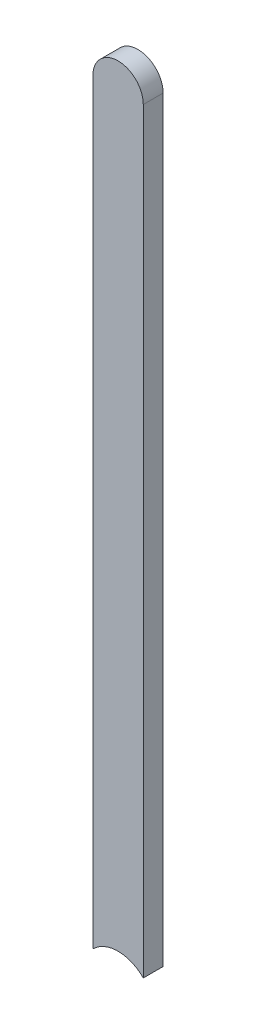
ISO-10303-21;
HEADER;
FILE_DESCRIPTION(('STEP AP214'),'2;1');
FILE_NAME('part.step','',(''),(''),'','','');
FILE_SCHEMA(('AUTOMOTIVE_DESIGN { 1 0 10303 214 1 1 1 1 }'));
ENDSEC;
DATA;
#1=APPLICATION_CONTEXT('core data for automotive mechanical design processes');
#2=APPLICATION_PROTOCOL_DEFINITION('international standard','automotive_design',2000,#1);
#3=PRODUCT_CONTEXT('',#1,'mechanical');
#4=PRODUCT('Part','Part','',(#3));
#5=PRODUCT_RELATED_PRODUCT_CATEGORY('part','',(#4));
#6=PRODUCT_DEFINITION_FORMATION('','',#4);
#7=PRODUCT_DEFINITION_CONTEXT('part definition',#1,'design');
#8=PRODUCT_DEFINITION('design','',#6,#7);
#9=PRODUCT_DEFINITION_SHAPE('','',#8);
#10=(LENGTH_UNIT() NAMED_UNIT(*) SI_UNIT(.MILLI.,.METRE.));
#11=(NAMED_UNIT(*) PLANE_ANGLE_UNIT() SI_UNIT($,.RADIAN.));
#12=(NAMED_UNIT(*) SI_UNIT($,.STERADIAN.) SOLID_ANGLE_UNIT());
#13=UNCERTAINTY_MEASURE_WITH_UNIT(LENGTH_MEASURE(1.E-05),#10,'distance_accuracy_value','');
#14=(GEOMETRIC_REPRESENTATION_CONTEXT(3) GLOBAL_UNCERTAINTY_ASSIGNED_CONTEXT((#13)) GLOBAL_UNIT_ASSIGNED_CONTEXT((#10,
#11,#12)) REPRESENTATION_CONTEXT('',''));
#15=CARTESIAN_POINT('',(0.,0.,0.));
#16=DIRECTION('',(0.,0.,1.));
#17=DIRECTION('',(1.,0.,0.));
#18=AXIS2_PLACEMENT_3D('',#15,#16,#17);
#19=CARTESIAN_POINT('',(136.652,111.881868157867,0.));
#20=DIRECTION('',(-1.,0.,0.));
#21=DIRECTION('',(0.,1.,0.));
#22=AXIS2_PLACEMENT_3D('',#19,#20,#21);
#23=PLANE('',#22);
#24=DIRECTION('',(0.,1.,0.));
#25=VECTOR('',#24,1.);
#26=CARTESIAN_POINT('',(136.652,111.633,0.1999996));
#27=LINE('',#26,#25);
#28=CARTESIAN_POINT('',(136.652,111.881868157867,0.1999996));
#29=VERTEX_POINT('',#28);
#30=CARTESIAN_POINT('',(136.652,119.507,0.1999996));
#31=VERTEX_POINT('',#30);
#32=EDGE_CURVE('E11',#29,#31,#27,.T.);
#33=ORIENTED_EDGE('',*,*,#32,.F.);
#34=DIRECTION('',(0.,0.,1.));
#35=VECTOR('',#34,1.);
#36=CARTESIAN_POINT('',(136.652,111.881868157867,0.));
#37=LINE('',#36,#35);
#38=CARTESIAN_POINT('',(136.652,111.881868157867,0.));
#39=VERTEX_POINT('',#38);
#40=EDGE_CURVE('E24',#39,#29,#37,.T.);
#41=ORIENTED_EDGE('',*,*,#40,.F.);
#42=DIRECTION('',(0.,1.,0.));
#43=VECTOR('',#42,1.);
#44=CARTESIAN_POINT('',(136.652,111.633,0.));
#45=LINE('',#44,#43);
#46=CARTESIAN_POINT('',(136.652,119.507,0.));
#47=VERTEX_POINT('',#46);
#48=EDGE_CURVE('E75',#39,#47,#45,.T.);
#49=ORIENTED_EDGE('',*,*,#48,.T.);
#50=DIRECTION('',(0.,0.,1.));
#51=VECTOR('',#50,1.);
#52=CARTESIAN_POINT('',(136.652,119.507,0.));
#53=LINE('',#52,#51);
#54=EDGE_CURVE('E37',#47,#31,#53,.T.);
#55=ORIENTED_EDGE('',*,*,#54,.T.);
#56=EDGE_LOOP('',(#33,#41,#49,#55));
#57=FACE_BOUND('',#56,.T.);
#58=ADVANCED_FACE('F17',(#57),#23,.F.);
#59=CARTESIAN_POINT('',(136.398,119.507,0.));
#60=DIRECTION('',(0.,0.,-1.));
#61=DIRECTION('',(1.,0.,0.));
#62=AXIS2_PLACEMENT_3D('',#59,#60,#61);
#63=CYLINDRICAL_SURFACE('',#62,0.253999999999986);
#64=CARTESIAN_POINT('',(136.398,119.507,0.1999996));
#65=DIRECTION('',(0.,0.,1.));
#66=DIRECTION('',(1.,0.,0.));
#67=AXIS2_PLACEMENT_3D('',#64,#65,#66);
#68=CIRCLE('',#67,0.253999999999986);
#69=CARTESIAN_POINT('',(136.144,119.507,0.1999996));
#70=VERTEX_POINT('',#69);
#71=EDGE_CURVE('E83',#31,#70,#68,.T.);
#72=ORIENTED_EDGE('',*,*,#71,.F.);
#73=ORIENTED_EDGE('',*,*,#54,.F.);
#74=CARTESIAN_POINT('',(136.398,119.507,0.));
#75=DIRECTION('',(0.,0.,1.));
#76=DIRECTION('',(1.,0.,0.));
#77=AXIS2_PLACEMENT_3D('',#74,#75,#76);
#78=CIRCLE('',#77,0.253999999999986);
#79=CARTESIAN_POINT('',(136.144,119.507,0.));
#80=VERTEX_POINT('',#79);
#81=EDGE_CURVE('E81',#47,#80,#78,.T.);
#82=ORIENTED_EDGE('',*,*,#81,.T.);
#83=DIRECTION('',(0.,0.,1.));
#84=VECTOR('',#83,1.);
#85=CARTESIAN_POINT('',(136.144,119.507,0.));
#86=LINE('',#85,#84);
#87=EDGE_CURVE('E67',#80,#70,#86,.T.);
#88=ORIENTED_EDGE('',*,*,#87,.T.);
#89=EDGE_LOOP('',(#72,#73,#82,#88));
#90=FACE_BOUND('',#89,.T.);
#91=ADVANCED_FACE('F89',(#90),#63,.T.);
#92=CARTESIAN_POINT('',(136.144,119.507,0.));
#93=DIRECTION('',(1.,0.,0.));
#94=DIRECTION('',(0.,-1.,0.));
#95=AXIS2_PLACEMENT_3D('',#92,#93,#94);
#96=PLANE('',#95);
#97=DIRECTION('',(0.,-1.,0.));
#98=VECTOR('',#97,1.);
#99=CARTESIAN_POINT('',(136.144,119.507,0.1999996));
#100=LINE('',#99,#98);
#101=CARTESIAN_POINT('',(136.144,111.881868157867,0.1999996));
#102=VERTEX_POINT('',#101);
#103=EDGE_CURVE('E71',#70,#102,#100,.T.);
#104=ORIENTED_EDGE('',*,*,#103,.F.);
#105=ORIENTED_EDGE('',*,*,#87,.F.);
#106=DIRECTION('',(0.,-1.,0.));
#107=VECTOR('',#106,1.);
#108=CARTESIAN_POINT('',(136.144,119.507,0.));
#109=LINE('',#108,#107);
#110=CARTESIAN_POINT('',(136.144,111.881868157867,0.));
#111=VERTEX_POINT('',#110);
#112=EDGE_CURVE('E63',#80,#111,#109,.T.);
#113=ORIENTED_EDGE('',*,*,#112,.T.);
#114=DIRECTION('',(0.,0.,1.));
#115=VECTOR('',#114,1.);
#116=CARTESIAN_POINT('',(136.144,111.881868157867,0.));
#117=LINE('',#116,#115);
#118=EDGE_CURVE('E53',#111,#102,#117,.T.);
#119=ORIENTED_EDGE('',*,*,#118,.T.);
#120=EDGE_LOOP('',(#104,#105,#113,#119));
#121=FACE_BOUND('',#120,.T.);
#122=ADVANCED_FACE('F66',(#121),#96,.F.);
#123=CARTESIAN_POINT('',(136.398,111.633,0.));
#124=DIRECTION('',(0.,0.,-1.));
#125=DIRECTION('',(1.,0.,0.));
#126=AXIS2_PLACEMENT_3D('',#123,#124,#125);
#127=CYLINDRICAL_SURFACE('',#126,0.3556);
#128=ORIENTED_EDGE('',*,*,#40,.T.);
#129=CARTESIAN_POINT('',(136.398,111.633,0.1999996));
#130=DIRECTION('',(0.,0.,1.));
#131=DIRECTION('',(1.,0.,0.));
#132=AXIS2_PLACEMENT_3D('',#129,#130,#131);
#133=CIRCLE('',#132,0.3556);
#134=EDGE_CURVE('E59',#29,#102,#133,.T.);
#135=ORIENTED_EDGE('',*,*,#134,.T.);
#136=ORIENTED_EDGE('',*,*,#118,.F.);
#137=CARTESIAN_POINT('',(136.398,111.633,0.));
#138=DIRECTION('',(0.,0.,1.));
#139=DIRECTION('',(1.,0.,0.));
#140=AXIS2_PLACEMENT_3D('',#137,#138,#139);
#141=CIRCLE('',#140,0.3556);
#142=EDGE_CURVE('E57',#39,#111,#141,.T.);
#143=ORIENTED_EDGE('',*,*,#142,.F.);
#144=EDGE_LOOP('',(#128,#135,#136,#143));
#145=FACE_BOUND('',#144,.T.);
#146=ADVANCED_FACE('F55',(#145),#127,.F.);
#147=CARTESIAN_POINT('',(136.652,111.633,0.));
#148=DIRECTION('',(0.,0.,-1.));
#149=DIRECTION('',(-1.,0.,0.));
#150=AXIS2_PLACEMENT_3D('',#147,#148,#149);
#151=PLANE('',#150);
#152=ORIENTED_EDGE('',*,*,#48,.F.);
#153=ORIENTED_EDGE('',*,*,#142,.T.);
#154=ORIENTED_EDGE('',*,*,#112,.F.);
#155=ORIENTED_EDGE('',*,*,#81,.F.);
#156=EDGE_LOOP('',(#152,#153,#154,#155));
#157=FACE_BOUND('',#156,.T.);
#158=ADVANCED_FACE('F74',(#157),#151,.T.);
#159=CARTESIAN_POINT('',(136.652,111.633,0.1999996));
#160=DIRECTION('',(0.,0.,-1.));
#161=DIRECTION('',(-1.,0.,0.));
#162=AXIS2_PLACEMENT_3D('',#159,#160,#161);
#163=PLANE('',#162);
#164=ORIENTED_EDGE('',*,*,#134,.F.);
#165=ORIENTED_EDGE('',*,*,#32,.T.);
#166=ORIENTED_EDGE('',*,*,#71,.T.);
#167=ORIENTED_EDGE('',*,*,#103,.T.);
#168=EDGE_LOOP('',(#164,#165,#166,#167));
#169=FACE_BOUND('',#168,.T.);
#170=ADVANCED_FACE('F91',(#169),#163,.F.);
#171=CLOSED_SHELL('',(#58,#91,#122,#146,#158,#170));
#172=MANIFOLD_SOLID_BREP('B1',#171);
#173=ADVANCED_BREP_SHAPE_REPRESENTATION('',(#18,#172),#14);
#174=SHAPE_DEFINITION_REPRESENTATION(#9,#173);
ENDSEC;
END-ISO-10303-21;
